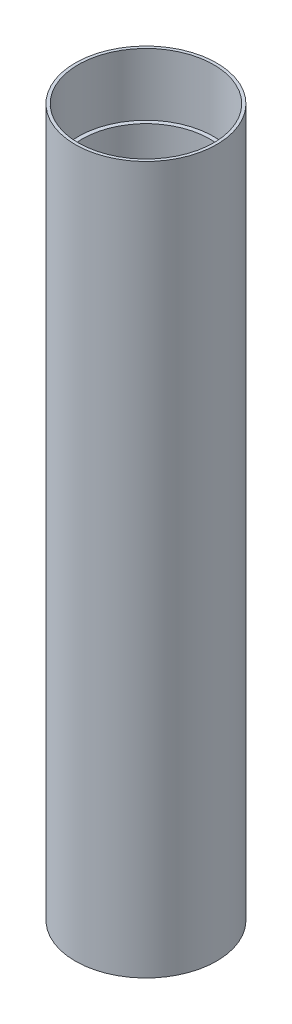
ISO-10303-21;
HEADER;
FILE_DESCRIPTION(('STEP AP214'),'2;1');
FILE_NAME('part.step','',(''),(''),'','','');
FILE_SCHEMA(('AUTOMOTIVE_DESIGN { 1 0 10303 214 1 1 1 1 }'));
ENDSEC;
DATA;
#1=APPLICATION_CONTEXT('core data for automotive mechanical design processes');
#2=APPLICATION_PROTOCOL_DEFINITION('international standard','automotive_design',2000,#1);
#3=PRODUCT_CONTEXT('',#1,'mechanical');
#4=PRODUCT('Part','Part','',(#3));
#5=PRODUCT_RELATED_PRODUCT_CATEGORY('part','',(#4));
#6=PRODUCT_DEFINITION_FORMATION('','',#4);
#7=PRODUCT_DEFINITION_CONTEXT('part definition',#1,'design');
#8=PRODUCT_DEFINITION('design','',#6,#7);
#9=PRODUCT_DEFINITION_SHAPE('','',#8);
#10=(LENGTH_UNIT() NAMED_UNIT(*) SI_UNIT(.MILLI.,.METRE.));
#11=(NAMED_UNIT(*) PLANE_ANGLE_UNIT() SI_UNIT($,.RADIAN.));
#12=(NAMED_UNIT(*) SI_UNIT($,.STERADIAN.) SOLID_ANGLE_UNIT());
#13=UNCERTAINTY_MEASURE_WITH_UNIT(LENGTH_MEASURE(1.E-05),#10,'distance_accuracy_value','');
#14=(GEOMETRIC_REPRESENTATION_CONTEXT(3) GLOBAL_UNCERTAINTY_ASSIGNED_CONTEXT((#13)) GLOBAL_UNIT_ASSIGNED_CONTEXT((#10,
#11,#12)) REPRESENTATION_CONTEXT('',''));
#15=CARTESIAN_POINT('',(0.,0.,0.));
#16=DIRECTION('',(0.,0.,1.));
#17=DIRECTION('',(1.,0.,0.));
#18=AXIS2_PLACEMENT_3D('',#15,#16,#17);
#19=CARTESIAN_POINT('',(0.,228.,0.));
#20=DIRECTION('',(0.,1.,0.));
#21=DIRECTION('',(0.,0.,1.));
#22=AXIS2_PLACEMENT_3D('',#19,#20,#21);
#23=PLANE('',#22);
#24=CARTESIAN_POINT('',(0.,228.,0.));
#25=DIRECTION('',(0.,1.,0.));
#26=DIRECTION('',(0.,0.,1.));
#27=AXIS2_PLACEMENT_3D('',#24,#25,#26);
#28=CIRCLE('',#27,22.5);
#29=CARTESIAN_POINT('',(0.,228.,22.5));
#30=VERTEX_POINT('',#29);
#31=EDGE_CURVE('E57',#30,#30,#28,.T.);
#32=ORIENTED_EDGE('',*,*,#31,.F.);
#33=EDGE_LOOP('',(#32));
#34=FACE_BOUND('',#33,.T.);
#35=CARTESIAN_POINT('',(0.,228.,0.));
#36=DIRECTION('',(0.,1.,0.));
#37=DIRECTION('',(0.,0.,1.));
#38=AXIS2_PLACEMENT_3D('',#35,#36,#37);
#39=CIRCLE('',#38,23.95);
#40=CARTESIAN_POINT('',(0.,228.,23.95));
#41=VERTEX_POINT('',#40);
#42=EDGE_CURVE('E10',#41,#41,#39,.F.);
#43=ORIENTED_EDGE('',*,*,#42,.F.);
#44=EDGE_LOOP('',(#43));
#45=FACE_BOUND('',#44,.T.);
#46=ADVANCED_FACE('F33',(#34,#45),#23,.T.);
#47=CARTESIAN_POINT('',(0.,250.,0.));
#48=DIRECTION('',(0.,-1.,0.));
#49=DIRECTION('',(0.,0.,-1.));
#50=AXIS2_PLACEMENT_3D('',#47,#48,#49);
#51=CYLINDRICAL_SURFACE('',#50,22.5);
#52=CARTESIAN_POINT('',(0.,22.,0.));
#53=DIRECTION('',(0.,-1.,0.));
#54=DIRECTION('',(0.,0.,-1.));
#55=AXIS2_PLACEMENT_3D('',#52,#53,#54);
#56=CIRCLE('',#55,22.5);
#57=CARTESIAN_POINT('',(0.,22.,-22.5));
#58=VERTEX_POINT('',#57);
#59=EDGE_CURVE('E49',#58,#58,#56,.T.);
#60=ORIENTED_EDGE('',*,*,#59,.T.);
#61=EDGE_LOOP('',(#60));
#62=FACE_BOUND('',#61,.T.);
#63=ORIENTED_EDGE('',*,*,#31,.T.);
#64=EDGE_LOOP('',(#63));
#65=FACE_BOUND('',#64,.T.);
#66=ADVANCED_FACE('F89',(#62,#65),#51,.F.);
#67=CARTESIAN_POINT('',(0.,250.,0.));
#68=DIRECTION('',(0.,1.,0.));
#69=DIRECTION('',(0.,0.,1.));
#70=AXIS2_PLACEMENT_3D('',#67,#68,#69);
#71=PLANE('',#70);
#72=CARTESIAN_POINT('',(0.,250.,0.));
#73=DIRECTION('',(0.,1.,0.));
#74=DIRECTION('',(0.,0.,1.));
#75=AXIS2_PLACEMENT_3D('',#72,#73,#74);
#76=CIRCLE('',#75,25.);
#77=CARTESIAN_POINT('',(0.,250.,25.));
#78=VERTEX_POINT('',#77);
#79=EDGE_CURVE('E40',#78,#78,#76,.T.);
#80=ORIENTED_EDGE('',*,*,#79,.T.);
#81=EDGE_LOOP('',(#80));
#82=FACE_BOUND('',#81,.T.);
#83=CARTESIAN_POINT('',(0.,250.,0.));
#84=DIRECTION('',(0.,1.,0.));
#85=DIRECTION('',(0.,0.,1.));
#86=AXIS2_PLACEMENT_3D('',#83,#84,#85);
#87=CIRCLE('',#86,23.95);
#88=CARTESIAN_POINT('',(0.,250.,23.95));
#89=VERTEX_POINT('',#88);
#90=EDGE_CURVE('E59',#89,#89,#87,.T.);
#91=ORIENTED_EDGE('',*,*,#90,.F.);
#92=EDGE_LOOP('',(#91));
#93=FACE_BOUND('',#92,.T.);
#94=ADVANCED_FACE('F81',(#82,#93),#71,.T.);
#95=CARTESIAN_POINT('',(0.,0.,0.));
#96=DIRECTION('',(0.,1.,0.));
#97=DIRECTION('',(0.,0.,1.));
#98=AXIS2_PLACEMENT_3D('',#95,#96,#97);
#99=PLANE('',#98);
#100=CARTESIAN_POINT('',(0.,0.,0.));
#101=DIRECTION('',(0.,-1.,0.));
#102=DIRECTION('',(0.,0.,-1.));
#103=AXIS2_PLACEMENT_3D('',#100,#101,#102);
#104=CIRCLE('',#103,24.);
#105=CARTESIAN_POINT('',(0.,0.,-24.));
#106=VERTEX_POINT('',#105);
#107=EDGE_CURVE('E52',#106,#106,#104,.T.);
#108=ORIENTED_EDGE('',*,*,#107,.F.);
#109=EDGE_LOOP('',(#108));
#110=FACE_BOUND('',#109,.T.);
#111=CARTESIAN_POINT('',(0.,0.,0.));
#112=DIRECTION('',(0.,1.,0.));
#113=DIRECTION('',(0.,0.,1.));
#114=AXIS2_PLACEMENT_3D('',#111,#112,#113);
#115=CIRCLE('',#114,25.);
#116=CARTESIAN_POINT('',(0.,0.,25.));
#117=VERTEX_POINT('',#116);
#118=EDGE_CURVE('E44',#117,#117,#115,.T.);
#119=ORIENTED_EDGE('',*,*,#118,.F.);
#120=EDGE_LOOP('',(#119));
#121=FACE_BOUND('',#120,.T.);
#122=ADVANCED_FACE('F78',(#110,#121),#99,.F.);
#123=CARTESIAN_POINT('',(0.,250.,0.));
#124=DIRECTION('',(0.,-1.,0.));
#125=DIRECTION('',(0.,0.,-1.));
#126=AXIS2_PLACEMENT_3D('',#123,#124,#125);
#127=CYLINDRICAL_SURFACE('',#126,25.);
#128=ORIENTED_EDGE('',*,*,#79,.F.);
#129=EDGE_LOOP('',(#128));
#130=FACE_BOUND('',#129,.T.);
#131=ORIENTED_EDGE('',*,*,#118,.T.);
#132=EDGE_LOOP('',(#131));
#133=FACE_BOUND('',#132,.T.);
#134=ADVANCED_FACE('F35',(#130,#133),#127,.T.);
#135=CARTESIAN_POINT('',(0.,22.,0.));
#136=DIRECTION('',(0.,-1.,0.));
#137=DIRECTION('',(0.,0.,-1.));
#138=AXIS2_PLACEMENT_3D('',#135,#136,#137);
#139=CYLINDRICAL_SURFACE('',#138,24.);
#140=CARTESIAN_POINT('',(0.,22.,0.));
#141=DIRECTION('',(0.,-1.,0.));
#142=DIRECTION('',(0.,0.,-1.));
#143=AXIS2_PLACEMENT_3D('',#140,#141,#142);
#144=CIRCLE('',#143,24.);
#145=CARTESIAN_POINT('',(0.,22.,-24.));
#146=VERTEX_POINT('',#145);
#147=EDGE_CURVE('E56',#146,#146,#144,.T.);
#148=ORIENTED_EDGE('',*,*,#147,.F.);
#149=EDGE_LOOP('',(#148));
#150=FACE_BOUND('',#149,.T.);
#151=ORIENTED_EDGE('',*,*,#107,.T.);
#152=EDGE_LOOP('',(#151));
#153=FACE_BOUND('',#152,.T.);
#154=ADVANCED_FACE('F72',(#150,#153),#139,.F.);
#155=CARTESIAN_POINT('',(0.,22.,0.));
#156=DIRECTION('',(0.,-1.,0.));
#157=DIRECTION('',(0.,0.,-1.));
#158=AXIS2_PLACEMENT_3D('',#155,#156,#157);
#159=PLANE('',#158);
#160=ORIENTED_EDGE('',*,*,#59,.F.);
#161=EDGE_LOOP('',(#160));
#162=FACE_BOUND('',#161,.T.);
#163=ORIENTED_EDGE('',*,*,#147,.T.);
#164=EDGE_LOOP('',(#163));
#165=FACE_BOUND('',#164,.T.);
#166=ADVANCED_FACE('F70',(#162,#165),#159,.T.);
#167=CARTESIAN_POINT('',(0.,250.,0.));
#168=DIRECTION('',(0.,-1.,0.));
#169=DIRECTION('',(0.,0.,-1.));
#170=AXIS2_PLACEMENT_3D('',#167,#168,#169);
#171=CYLINDRICAL_SURFACE('',#170,23.95);
#172=ORIENTED_EDGE('',*,*,#90,.T.);
#173=EDGE_LOOP('',(#172));
#174=FACE_BOUND('',#173,.T.);
#175=ORIENTED_EDGE('',*,*,#42,.T.);
#176=EDGE_LOOP('',(#175));
#177=FACE_BOUND('',#176,.T.);
#178=ADVANCED_FACE('F100',(#174,#177),#171,.F.);
#179=CLOSED_SHELL('',(#46,#66,#94,#122,#134,#154,#166,#178));
#180=MANIFOLD_SOLID_BREP('B2',#179);
#181=ADVANCED_BREP_SHAPE_REPRESENTATION('',(#18,#180),#14);
#182=SHAPE_DEFINITION_REPRESENTATION(#9,#181);
ENDSEC;
END-ISO-10303-21;
